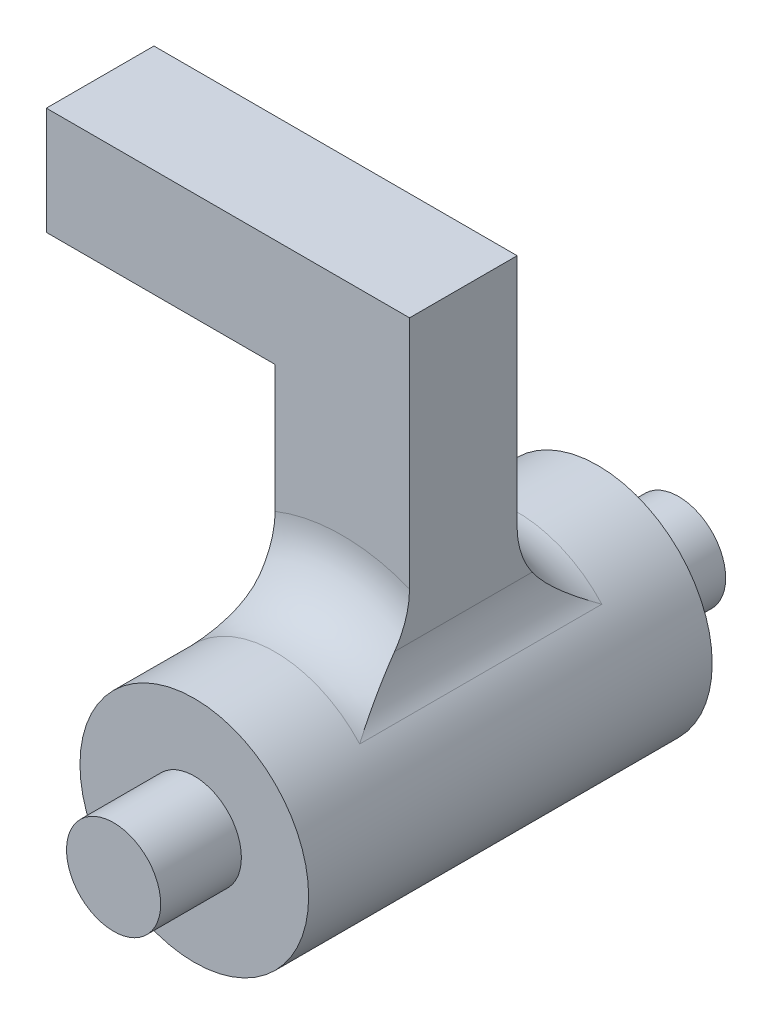
ISO-10303-21;
HEADER;
FILE_DESCRIPTION(('STEP AP214'),'2;1');
FILE_NAME('part.step','',(''),(''),'','','');
FILE_SCHEMA(('AUTOMOTIVE_DESIGN { 1 0 10303 214 1 1 1 1 }'));
ENDSEC;
DATA;
#1=APPLICATION_CONTEXT('core data for automotive mechanical design processes');
#2=APPLICATION_PROTOCOL_DEFINITION('international standard','automotive_design',2000,#1);
#3=PRODUCT_CONTEXT('',#1,'mechanical');
#4=PRODUCT('Part','Part','',(#3));
#5=PRODUCT_RELATED_PRODUCT_CATEGORY('part','',(#4));
#6=PRODUCT_DEFINITION_FORMATION('','',#4);
#7=PRODUCT_DEFINITION_CONTEXT('part definition',#1,'design');
#8=PRODUCT_DEFINITION('design','',#6,#7);
#9=PRODUCT_DEFINITION_SHAPE('','',#8);
#10=(LENGTH_UNIT() NAMED_UNIT(*) SI_UNIT(.MILLI.,.METRE.));
#11=(NAMED_UNIT(*) PLANE_ANGLE_UNIT() SI_UNIT($,.RADIAN.));
#12=(NAMED_UNIT(*) SI_UNIT($,.STERADIAN.) SOLID_ANGLE_UNIT());
#13=UNCERTAINTY_MEASURE_WITH_UNIT(LENGTH_MEASURE(1.E-05),#10,'distance_accuracy_value','');
#14=(GEOMETRIC_REPRESENTATION_CONTEXT(3) GLOBAL_UNCERTAINTY_ASSIGNED_CONTEXT((#13)) GLOBAL_UNIT_ASSIGNED_CONTEXT((#10,
#11,#12)) REPRESENTATION_CONTEXT('',''));
#15=CARTESIAN_POINT('',(0.,0.,0.));
#16=DIRECTION('',(0.,0.,1.));
#17=DIRECTION('',(1.,0.,0.));
#18=AXIS2_PLACEMENT_3D('',#15,#16,#17);
#19=CARTESIAN_POINT('',(-5.,6.87386354243376,-4.));
#20=DIRECTION('',(-1.,0.,0.));
#21=DIRECTION('',(0.,0.,1.));
#22=AXIS2_PLACEMENT_3D('',#19,#20,#21);
#23=PLANE('',#22);
#24=DIRECTION('',(0.,-1.,0.));
#25=VECTOR('',#24,1.);
#26=CARTESIAN_POINT('',(-5.,6.87386354243376,4.));
#27=LINE('',#26,#25);
#28=CARTESIAN_POINT('',(-5.,22.,4.));
#29=VERTEX_POINT('',#28);
#30=CARTESIAN_POINT('',(-5.,12.5399362039845,4.));
#31=VERTEX_POINT('',#30);
#32=EDGE_CURVE('E152',#29,#31,#27,.T.);
#33=ORIENTED_EDGE('',*,*,#32,.F.);
#34=DIRECTION('',(0.,0.,1.));
#35=VECTOR('',#34,1.);
#36=CARTESIAN_POINT('',(-5.,22.,-4.));
#37=LINE('',#36,#35);
#38=CARTESIAN_POINT('',(-5.,22.,-4.));
#39=VERTEX_POINT('',#38);
#40=EDGE_CURVE('E133',#39,#29,#37,.T.);
#41=ORIENTED_EDGE('',*,*,#40,.F.);
#42=DIRECTION('',(0.,-1.,0.));
#43=VECTOR('',#42,1.);
#44=CARTESIAN_POINT('',(-5.,6.87386354243376,-4.));
#45=LINE('',#44,#43);
#46=CARTESIAN_POINT('',(-5.,12.5399362039845,-4.));
#47=VERTEX_POINT('',#46);
#48=EDGE_CURVE('E139',#39,#47,#45,.T.);
#49=ORIENTED_EDGE('',*,*,#48,.T.);
#50=CARTESIAN_POINT('',(-5.,12.5399362039845,-4.));
#51=CARTESIAN_POINT('',(-5.,12.3694085919092,-3.99998714422389));
#52=CARTESIAN_POINT('',(-5.,12.1989063089274,-4.00752657628612));
#53=CARTESIAN_POINT('',(-5.,11.8592270326315,-4.03735103854057));
#54=CARTESIAN_POINT('',(-5.,11.6900497816317,-4.0596331257882));
#55=CARTESIAN_POINT('',(-5.,11.3583979344789,-4.11785187790329));
#56=CARTESIAN_POINT('',(-5.,11.1958612397524,-4.15343553921982));
#57=CARTESIAN_POINT('',(-5.,10.8743134865361,-4.23786698790894));
#58=CARTESIAN_POINT('',(-5.,10.7153021430001,-4.2867136986208));
#59=CARTESIAN_POINT('',(-5.,10.2970146643376,-4.4342238410057));
#60=CARTESIAN_POINT('',(-5.,10.0416978692588,-4.54437080778304));
#61=CARTESIAN_POINT('',(-5.,9.54316380755927,-4.80106627768752));
#62=CARTESIAN_POINT('',(-5.,9.30031970580392,-4.94833962290911));
#63=CARTESIAN_POINT('',(-5.,9.06917857360853,-5.11203717966495));
#64=B_SPLINE_CURVE_WITH_KNOTS('',3,(#50,#51,#52,#53,#54,#55,#56,#57,#58,#59,#60,#61,#62,#63),
.UNSPECIFIED.,.F.,.F.,(4,2,2,2,2,2,4),(0.,0.511379080440641,1.02265610962914,1.52123041197419,
2.01976425341574,2.85123665411686,3.70040530911326),.UNSPECIFIED.);
#65=CARTESIAN_POINT('',(-5.,9.06917857360853,-5.11203717966495));
#66=VERTEX_POINT('',#65);
#67=EDGE_CURVE('E192',#47,#66,#64,.T.);
#68=ORIENTED_EDGE('',*,*,#67,.T.);
#69=DIRECTION('',(0.,0.,-1.));
#70=VECTOR('',#69,1.);
#71=CARTESIAN_POINT('',(-5.,9.06917857360853,4.));
#72=LINE('',#71,#70);
#73=CARTESIAN_POINT('',(-5.,9.06917857360853,5.11203717966495));
#74=VERTEX_POINT('',#73);
#75=EDGE_CURVE('E179',#66,#74,#72,.F.);
#76=ORIENTED_EDGE('',*,*,#75,.T.);
#77=CARTESIAN_POINT('',(-5.,9.06917857360853,5.11203717966495));
#78=CARTESIAN_POINT('',(-5.,9.35083587334997,4.91258141395454));
#79=CARTESIAN_POINT('',(-5.,9.64971744535945,4.73756248373423));
#80=CARTESIAN_POINT('',(-5.,10.2648265740955,4.44415908956347));
#81=CARTESIAN_POINT('',(-5.,10.5804255183289,4.32445608668554));
#82=CARTESIAN_POINT('',(-5.,11.1666291518027,4.15632972078426));
#83=CARTESIAN_POINT('',(-5.,11.4346257489503,4.09876810840968));
#84=CARTESIAN_POINT('',(-5.,11.8433602430482,4.04005053354567));
#85=CARTESIAN_POINT('',(-5.,11.9822122250312,4.02507637574833));
#86=CARTESIAN_POINT('',(-5.,12.2606725330783,4.00504927505644));
#87=CARTESIAN_POINT('',(-5.,12.4002810845917,3.999999473362));
#88=CARTESIAN_POINT('',(-5.,12.5399362039845,4.));
#89=B_SPLINE_CURVE_WITH_KNOTS('',3,(#77,#78,#79,#80,#81,#82,#83,#84,#85,#86,#87,#88),
.UNSPECIFIED.,.F.,.F.,(4,2,2,2,2,4),(0.,1.03406706077952,2.042021674735,2.86168437258116,
3.2803387686077,3.69912565338787),.UNSPECIFIED.);
#90=EDGE_CURVE('E46',#74,#31,#89,.T.);
#91=ORIENTED_EDGE('',*,*,#90,.T.);
#92=EDGE_LOOP('',(#33,#41,#49,#68,#76,#91));
#93=FACE_BOUND('',#92,.T.);
#94=ADVANCED_FACE('F37',(#93),#23,.T.);
#95=CARTESIAN_POINT('',(0.,0.,-15.));
#96=DIRECTION('',(0.,0.,1.));
#97=DIRECTION('',(1.,0.,0.));
#98=AXIS2_PLACEMENT_3D('',#95,#96,#97);
#99=CYLINDRICAL_SURFACE('',#98,8.5);
#100=DIRECTION('',(0.,0.,1.));
#101=VECTOR('',#100,1.);
#102=CARTESIAN_POINT('',(-6.2962962962963,5.71022354634611,-15.));
#103=LINE('',#102,#101);
#104=CARTESIAN_POINT('',(-6.2962962962963,5.71022354634611,9.));
#105=VERTEX_POINT('',#104);
#106=CARTESIAN_POINT('',(-6.2962962962963,5.71022354634611,-9.));
#107=VERTEX_POINT('',#106);
#108=EDGE_CURVE('E172',#105,#107,#103,.F.);
#109=ORIENTED_EDGE('',*,*,#108,.T.);
#110=CARTESIAN_POINT('',(0.,0.,-9.));
#111=DIRECTION('',(0.,0.,1.));
#112=DIRECTION('',(1.,0.,0.));
#113=AXIS2_PLACEMENT_3D('',#110,#111,#112);
#114=CIRCLE('',#113,8.5);
#115=CARTESIAN_POINT('',(6.2962962962963,5.71022354634611,-9.));
#116=VERTEX_POINT('',#115);
#117=EDGE_CURVE('E174',#107,#116,#114,.F.);
#118=ORIENTED_EDGE('',*,*,#117,.T.);
#119=DIRECTION('',(0.,0.,1.));
#120=VECTOR('',#119,1.);
#121=CARTESIAN_POINT('',(6.2962962962963,5.71022354634611,-15.));
#122=LINE('',#121,#120);
#123=CARTESIAN_POINT('',(6.2962962962963,5.71022354634611,9.));
#124=VERTEX_POINT('',#123);
#125=EDGE_CURVE('E168',#116,#124,#122,.T.);
#126=ORIENTED_EDGE('',*,*,#125,.T.);
#127=CARTESIAN_POINT('',(0.,0.,9.));
#128=DIRECTION('',(0.,0.,1.));
#129=DIRECTION('',(1.,0.,0.));
#130=AXIS2_PLACEMENT_3D('',#127,#128,#129);
#131=CIRCLE('',#130,8.5);
#132=EDGE_CURVE('E170',#124,#105,#131,.T.);
#133=ORIENTED_EDGE('',*,*,#132,.T.);
#134=EDGE_LOOP('',(#109,#118,#126,#133));
#135=FACE_BOUND('',#134,.T.);
#136=CARTESIAN_POINT('',(0.,0.,-15.));
#137=DIRECTION('',(0.,0.,1.));
#138=DIRECTION('',(1.,0.,0.));
#139=AXIS2_PLACEMENT_3D('',#136,#137,#138);
#140=CIRCLE('',#139,8.5);
#141=CARTESIAN_POINT('',(8.5,0.,-15.));
#142=VERTEX_POINT('',#141);
#143=EDGE_CURVE('E165',#142,#142,#140,.T.);
#144=ORIENTED_EDGE('',*,*,#143,.T.);
#145=EDGE_LOOP('',(#144));
#146=FACE_BOUND('',#145,.T.);
#147=CARTESIAN_POINT('',(0.,0.,15.));
#148=DIRECTION('',(0.,0.,1.));
#149=DIRECTION('',(1.,0.,0.));
#150=AXIS2_PLACEMENT_3D('',#147,#148,#149);
#151=CIRCLE('',#150,8.5);
#152=CARTESIAN_POINT('',(8.5,0.,15.));
#153=VERTEX_POINT('',#152);
#154=EDGE_CURVE('E162',#153,#153,#151,.T.);
#155=ORIENTED_EDGE('',*,*,#154,.F.);
#156=EDGE_LOOP('',(#155));
#157=FACE_BOUND('',#156,.T.);
#158=ADVANCED_FACE('F232',(#135,#146,#157),#99,.T.);
#159=CARTESIAN_POINT('',(0.,0.,-15.));
#160=DIRECTION('',(0.,0.,1.));
#161=DIRECTION('',(1.,0.,0.));
#162=AXIS2_PLACEMENT_3D('',#159,#160,#161);
#163=PLANE('',#162);
#164=CARTESIAN_POINT('',(0.,0.,-15.));
#165=DIRECTION('',(0.,0.,1.));
#166=DIRECTION('',(1.,0.,0.));
#167=AXIS2_PLACEMENT_3D('',#164,#165,#166);
#168=CIRCLE('',#167,3.5);
#169=CARTESIAN_POINT('',(3.5,0.,-15.));
#170=VERTEX_POINT('',#169);
#171=EDGE_CURVE('E265',#170,#170,#168,.T.);
#172=ORIENTED_EDGE('',*,*,#171,.T.);
#173=EDGE_LOOP('',(#172));
#174=FACE_BOUND('',#173,.T.);
#175=ORIENTED_EDGE('',*,*,#143,.F.);
#176=EDGE_LOOP('',(#175));
#177=FACE_BOUND('',#176,.T.);
#178=ADVANCED_FACE('F380',(#174,#177),#163,.F.);
#179=CARTESIAN_POINT('',(0.,0.,15.));
#180=DIRECTION('',(0.,0.,1.));
#181=DIRECTION('',(1.,0.,0.));
#182=AXIS2_PLACEMENT_3D('',#179,#180,#181);
#183=PLANE('',#182);
#184=CARTESIAN_POINT('',(0.,0.,15.));
#185=DIRECTION('',(0.,0.,1.));
#186=DIRECTION('',(1.,0.,0.));
#187=AXIS2_PLACEMENT_3D('',#184,#185,#186);
#188=CIRCLE('',#187,3.5);
#189=CARTESIAN_POINT('',(3.5,0.,15.));
#190=VERTEX_POINT('',#189);
#191=EDGE_CURVE('E11',#190,#190,#188,.T.);
#192=ORIENTED_EDGE('',*,*,#191,.F.);
#193=EDGE_LOOP('',(#192));
#194=FACE_BOUND('',#193,.T.);
#195=ORIENTED_EDGE('',*,*,#154,.T.);
#196=EDGE_LOOP('',(#195));
#197=FACE_BOUND('',#196,.T.);
#198=ADVANCED_FACE('F209',(#194,#197),#183,.T.);
#199=CARTESIAN_POINT('',(5.,6.87386354243376,-4.));
#200=DIRECTION('',(1.,0.,0.));
#201=DIRECTION('',(0.,0.,-1.));
#202=AXIS2_PLACEMENT_3D('',#199,#200,#201);
#203=PLANE('',#202);
#204=CARTESIAN_POINT('',(5.,12.5399362039845,4.));
#205=CARTESIAN_POINT('',(5.,12.3694085919092,3.99998714422389));
#206=CARTESIAN_POINT('',(5.,12.1989063089274,4.00752657628612));
#207=CARTESIAN_POINT('',(5.,11.8592270326315,4.03735103854057));
#208=CARTESIAN_POINT('',(5.,11.6900497816317,4.0596331257882));
#209=CARTESIAN_POINT('',(5.,11.3583979344789,4.11785187790329));
#210=CARTESIAN_POINT('',(5.,11.1958612397524,4.15343553921982));
#211=CARTESIAN_POINT('',(5.,10.8743134865361,4.23786698790894));
#212=CARTESIAN_POINT('',(5.,10.7153021430001,4.2867136986208));
#213=CARTESIAN_POINT('',(5.,10.2970146643376,4.4342238410057));
#214=CARTESIAN_POINT('',(5.,10.0416978692588,4.54437080778304));
#215=CARTESIAN_POINT('',(5.,9.54316380755927,4.80106627768752));
#216=CARTESIAN_POINT('',(5.,9.30031970580392,4.94833962290911));
#217=CARTESIAN_POINT('',(5.,9.06917857360853,5.11203717966495));
#218=B_SPLINE_CURVE_WITH_KNOTS('',3,(#204,#205,#206,#207,#208,#209,#210,#211,#212,#213,#214,
#215,#216,#217),.UNSPECIFIED.,.F.,.F.,(4,2,2,2,2,2,4),(0.,0.511379080440641,1.02265610962914,
1.52123041197419,2.01976425341574,2.85123665411686,3.70040530911326),.UNSPECIFIED.);
#219=CARTESIAN_POINT('',(5.,12.5399362039845,4.));
#220=VERTEX_POINT('',#219);
#221=CARTESIAN_POINT('',(5.,9.06917857360853,5.11203717966495));
#222=VERTEX_POINT('',#221);
#223=EDGE_CURVE('E213',#220,#222,#218,.T.);
#224=ORIENTED_EDGE('',*,*,#223,.T.);
#225=DIRECTION('',(0.,0.,-1.));
#226=VECTOR('',#225,1.);
#227=CARTESIAN_POINT('',(5.,9.06917857360853,-4.));
#228=LINE('',#227,#226);
#229=CARTESIAN_POINT('',(5.,9.06917857360853,-5.11203717966495));
#230=VERTEX_POINT('',#229);
#231=EDGE_CURVE('E61',#222,#230,#228,.T.);
#232=ORIENTED_EDGE('',*,*,#231,.T.);
#233=CARTESIAN_POINT('',(5.,9.06917857360853,-5.11203717966495));
#234=CARTESIAN_POINT('',(5.,9.35083587334997,-4.91258141395454));
#235=CARTESIAN_POINT('',(5.,9.64971744535945,-4.73756248373423));
#236=CARTESIAN_POINT('',(5.,10.2648265740955,-4.44415908956347));
#237=CARTESIAN_POINT('',(5.,10.5804255183289,-4.32445608668554));
#238=CARTESIAN_POINT('',(5.,11.1666291518027,-4.15632972078426));
#239=CARTESIAN_POINT('',(5.,11.4346257489503,-4.09876810840968));
#240=CARTESIAN_POINT('',(5.,11.8433602430482,-4.04005053354567));
#241=CARTESIAN_POINT('',(5.,11.9822122250312,-4.02507637574833));
#242=CARTESIAN_POINT('',(5.,12.2606725330783,-4.00504927505644));
#243=CARTESIAN_POINT('',(5.,12.4002810845917,-3.999999473362));
#244=CARTESIAN_POINT('',(5.,12.5399362039845,-4.));
#245=B_SPLINE_CURVE_WITH_KNOTS('',3,(#233,#234,#235,#236,#237,#238,#239,#240,#241,#242,#243,
#244),.UNSPECIFIED.,.F.,.F.,(4,2,2,2,2,4),(0.,1.03406706077952,2.042021674735,2.86168437258116,
3.2803387686077,3.69912565338787),.UNSPECIFIED.);
#246=CARTESIAN_POINT('',(5.,12.5399362039845,-4.));
#247=VERTEX_POINT('',#246);
#248=EDGE_CURVE('E184',#230,#247,#245,.T.);
#249=ORIENTED_EDGE('',*,*,#248,.T.);
#250=DIRECTION('',(0.,1.,0.));
#251=VECTOR('',#250,1.);
#252=CARTESIAN_POINT('',(5.,6.87386354243376,-4.));
#253=LINE('',#252,#251);
#254=CARTESIAN_POINT('',(5.,30.,-4.));
#255=VERTEX_POINT('',#254);
#256=EDGE_CURVE('E154',#247,#255,#253,.T.);
#257=ORIENTED_EDGE('',*,*,#256,.T.);
#258=DIRECTION('',(0.,0.,1.));
#259=VECTOR('',#258,1.);
#260=CARTESIAN_POINT('',(5.,30.,-4.));
#261=LINE('',#260,#259);
#262=CARTESIAN_POINT('',(5.,30.,4.));
#263=VERTEX_POINT('',#262);
#264=EDGE_CURVE('E159',#255,#263,#261,.T.);
#265=ORIENTED_EDGE('',*,*,#264,.T.);
#266=DIRECTION('',(0.,1.,0.));
#267=VECTOR('',#266,1.);
#268=CARTESIAN_POINT('',(5.,6.87386354243376,4.));
#269=LINE('',#268,#267);
#270=EDGE_CURVE('E147',#220,#263,#269,.T.);
#271=ORIENTED_EDGE('',*,*,#270,.F.);
#272=EDGE_LOOP('',(#224,#232,#249,#257,#265,#271));
#273=FACE_BOUND('',#272,.T.);
#274=ADVANCED_FACE('F203',(#273),#203,.T.);
#275=CARTESIAN_POINT('',(-5.,30.,-4.));
#276=DIRECTION('',(0.,1.,0.));
#277=DIRECTION('',(0.,0.,1.));
#278=AXIS2_PLACEMENT_3D('',#275,#276,#277);
#279=PLANE('',#278);
#280=DIRECTION('',(-1.,0.,0.));
#281=VECTOR('',#280,1.);
#282=CARTESIAN_POINT('',(-5.,30.,-4.));
#283=LINE('',#282,#281);
#284=CARTESIAN_POINT('',(-22.,30.,-4.));
#285=VERTEX_POINT('',#284);
#286=EDGE_CURVE('E156',#255,#285,#283,.T.);
#287=ORIENTED_EDGE('',*,*,#286,.T.);
#288=DIRECTION('',(0.,0.,-1.));
#289=VECTOR('',#288,1.);
#290=CARTESIAN_POINT('',(-22.,30.,-4.));
#291=LINE('',#290,#289);
#292=CARTESIAN_POINT('',(-22.,30.,4.));
#293=VERTEX_POINT('',#292);
#294=EDGE_CURVE('E130',#293,#285,#291,.T.);
#295=ORIENTED_EDGE('',*,*,#294,.F.);
#296=DIRECTION('',(-1.,0.,0.));
#297=VECTOR('',#296,1.);
#298=CARTESIAN_POINT('',(-5.,30.,4.));
#299=LINE('',#298,#297);
#300=EDGE_CURVE('E149',#263,#293,#299,.T.);
#301=ORIENTED_EDGE('',*,*,#300,.F.);
#302=ORIENTED_EDGE('',*,*,#264,.F.);
#303=EDGE_LOOP('',(#287,#295,#301,#302));
#304=FACE_BOUND('',#303,.T.);
#305=ADVANCED_FACE('F208',(#304),#279,.T.);
#306=CARTESIAN_POINT('',(0.,0.,-4.));
#307=DIRECTION('',(0.,0.,1.));
#308=DIRECTION('',(1.,0.,0.));
#309=AXIS2_PLACEMENT_3D('',#306,#307,#308);
#310=PLANE('',#309);
#311=ORIENTED_EDGE('',*,*,#256,.F.);
#312=CARTESIAN_POINT('',(0.,0.,-4.));
#313=DIRECTION('',(0.,0.,1.));
#314=DIRECTION('',(1.,0.,0.));
#315=AXIS2_PLACEMENT_3D('',#312,#313,#314);
#316=CIRCLE('',#315,13.5);
#317=EDGE_CURVE('E177',#247,#47,#316,.T.);
#318=ORIENTED_EDGE('',*,*,#317,.T.);
#319=ORIENTED_EDGE('',*,*,#48,.F.);
#320=DIRECTION('',(1.,0.,0.));
#321=VECTOR('',#320,1.);
#322=CARTESIAN_POINT('',(-22.,22.,-4.));
#323=LINE('',#322,#321);
#324=CARTESIAN_POINT('',(-22.,22.,-4.));
#325=VERTEX_POINT('',#324);
#326=EDGE_CURVE('E119',#325,#39,#323,.T.);
#327=ORIENTED_EDGE('',*,*,#326,.F.);
#328=DIRECTION('',(0.,-1.,0.));
#329=VECTOR('',#328,1.);
#330=CARTESIAN_POINT('',(-22.,30.,-4.));
#331=LINE('',#330,#329);
#332=EDGE_CURVE('E124',#285,#325,#331,.T.);
#333=ORIENTED_EDGE('',*,*,#332,.F.);
#334=ORIENTED_EDGE('',*,*,#286,.F.);
#335=EDGE_LOOP('',(#311,#318,#319,#327,#333,#334));
#336=FACE_BOUND('',#335,.T.);
#337=ADVANCED_FACE('F137',(#336),#310,.F.);
#338=CARTESIAN_POINT('',(0.,0.,4.));
#339=DIRECTION('',(0.,0.,1.));
#340=DIRECTION('',(1.,0.,0.));
#341=AXIS2_PLACEMENT_3D('',#338,#339,#340);
#342=PLANE('',#341);
#343=ORIENTED_EDGE('',*,*,#300,.T.);
#344=DIRECTION('',(0.,1.,0.));
#345=VECTOR('',#344,1.);
#346=CARTESIAN_POINT('',(-22.,30.,4.));
#347=LINE('',#346,#345);
#348=CARTESIAN_POINT('',(-22.,22.,4.));
#349=VERTEX_POINT('',#348);
#350=EDGE_CURVE('E123',#349,#293,#347,.T.);
#351=ORIENTED_EDGE('',*,*,#350,.F.);
#352=DIRECTION('',(1.,0.,0.));
#353=VECTOR('',#352,1.);
#354=CARTESIAN_POINT('',(-22.,22.,4.));
#355=LINE('',#354,#353);
#356=EDGE_CURVE('E53',#349,#29,#355,.T.);
#357=ORIENTED_EDGE('',*,*,#356,.T.);
#358=ORIENTED_EDGE('',*,*,#32,.T.);
#359=CARTESIAN_POINT('',(0.,0.,4.));
#360=DIRECTION('',(0.,0.,1.));
#361=DIRECTION('',(1.,0.,0.));
#362=AXIS2_PLACEMENT_3D('',#359,#360,#361);
#363=CIRCLE('',#362,13.5);
#364=EDGE_CURVE('E181',#31,#220,#363,.F.);
#365=ORIENTED_EDGE('',*,*,#364,.T.);
#366=ORIENTED_EDGE('',*,*,#270,.T.);
#367=EDGE_LOOP('',(#343,#351,#357,#358,#365,#366));
#368=FACE_BOUND('',#367,.T.);
#369=ADVANCED_FACE('F237',(#368),#342,.T.);
#370=CARTESIAN_POINT('',(0.,0.,9.));
#371=DIRECTION('',(0.,0.,1.));
#372=DIRECTION('',(1.,0.,0.));
#373=AXIS2_PLACEMENT_3D('',#370,#371,#372);
#374=TOROIDAL_SURFACE('',#373,13.5,5.);
#375=ORIENTED_EDGE('',*,*,#364,.F.);
#376=ORIENTED_EDGE('',*,*,#90,.F.);
#377=CARTESIAN_POINT('',(-5.,9.06917857360853,5.11203717966495));
#378=CARTESIAN_POINT('',(-5.00000456566752,8.98149623455941,5.17412707086535));
#379=CARTESIAN_POINT('',(-5.00230580407492,8.8950971832883,5.23795960498045));
#380=CARTESIAN_POINT('',(-5.01113532528489,8.72495318604548,5.36870836115563));
#381=CARTESIAN_POINT('',(-5.0176614222909,8.64120689111644,5.43562297203663));
#382=CARTESIAN_POINT('',(-5.04298695211363,8.39438304664872,5.64012389415181));
#383=CARTESIAN_POINT('',(-5.06753758449846,8.2352536504483,5.78180156997005));
#384=CARTESIAN_POINT('',(-5.12926367484856,7.92894640891691,6.0721159477134));
#385=CARTESIAN_POINT('',(-5.16632563328503,7.78167536285091,6.22068007663244));
#386=CARTESIAN_POINT('',(-5.25130561853298,7.49692494635604,6.52404688750906));
#387=CARTESIAN_POINT('',(-5.29922905463911,7.3594504998795,6.67885264626912));
#388=CARTESIAN_POINT('',(-5.40927870973451,7.08183521069683,7.0071096101508));
#389=CARTESIAN_POINT('',(-5.47229235078683,6.94255752223811,7.18098930523587));
#390=CARTESIAN_POINT('',(-5.608450439954,6.67398020689119,7.53267376835567));
#391=CARTESIAN_POINT('',(-5.68160396824985,6.54468968685417,7.71048193297954));
#392=CARTESIAN_POINT('',(-5.83845873024377,6.29360442579319,8.07114210683326));
#393=CARTESIAN_POINT('',(-5.92230033266602,6.17194932899998,8.25402981016555));
#394=CARTESIAN_POINT('',(-6.09932946666348,5.93767586596806,8.62092832740647));
#395=CARTESIAN_POINT('',(-6.19251208640549,5.82505280587074,8.80493850376675));
#396=CARTESIAN_POINT('',(-6.29236130153601,5.71456625572437,8.99261452477556));
#397=CARTESIAN_POINT('',(-6.29432785178177,5.71239403349407,8.99630727037904));
#398=CARTESIAN_POINT('',(-6.2962962962963,5.71022354634611,9.));
#399=B_SPLINE_CURVE_WITH_KNOTS('',3,(#377,#378,#379,#380,#381,#382,#383,#384,#385,#386,#387,
#388,#389,#390,#391,#392,#393,#394,#395,#396,#397,#398),.UNSPECIFIED.,.F.,.F.,(4,2,2,2,2,2,2,2,
2,2,4),(0.,0.322207999236539,0.644249432211043,1.28661815615915,1.92330944507016,
2.56031852208615,3.25435709633224,3.94902124033134,4.65399014148018,5.35859027072397,
5.37273240845879),.UNSPECIFIED.);
#400=EDGE_CURVE('E150',#105,#74,#399,.F.);
#401=ORIENTED_EDGE('',*,*,#400,.F.);
#402=ORIENTED_EDGE('',*,*,#132,.F.);
#403=CARTESIAN_POINT('',(5.,9.06917857360853,5.11203717966495));
#404=CARTESIAN_POINT('',(5.00000456566752,8.98149623455941,5.17412707086535));
#405=CARTESIAN_POINT('',(5.00230580407492,8.8950971832883,5.23795960498045));
#406=CARTESIAN_POINT('',(5.01113532528489,8.72495318604548,5.36870836115563));
#407=CARTESIAN_POINT('',(5.0176614222909,8.64120689111644,5.43562297203663));
#408=CARTESIAN_POINT('',(5.04298695211363,8.39438304664872,5.64012389415181));
#409=CARTESIAN_POINT('',(5.06753758449846,8.2352536504483,5.78180156997005));
#410=CARTESIAN_POINT('',(5.12926367484856,7.92894640891691,6.0721159477134));
#411=CARTESIAN_POINT('',(5.16632563328503,7.78167536285091,6.22068007663244));
#412=CARTESIAN_POINT('',(5.25130561853298,7.49692494635604,6.52404688750906));
#413=CARTESIAN_POINT('',(5.29922905463911,7.3594504998795,6.67885264626912));
#414=CARTESIAN_POINT('',(5.40927870973451,7.08183521069683,7.0071096101508));
#415=CARTESIAN_POINT('',(5.47229235078683,6.94255752223811,7.18098930523587));
#416=CARTESIAN_POINT('',(5.608450439954,6.67398020689119,7.53267376835567));
#417=CARTESIAN_POINT('',(5.68160396824985,6.54468968685417,7.71048193297954));
#418=CARTESIAN_POINT('',(5.83845873024377,6.29360442579319,8.07114210683326));
#419=CARTESIAN_POINT('',(5.92230033266602,6.17194932899998,8.25402981016555));
#420=CARTESIAN_POINT('',(6.09932946666348,5.93767586596806,8.62092832740647));
#421=CARTESIAN_POINT('',(6.19251208640549,5.82505280587074,8.80493850376675));
#422=CARTESIAN_POINT('',(6.29236130153601,5.71456625572437,8.99261452477556));
#423=CARTESIAN_POINT('',(6.29432785178177,5.71239403349407,8.99630727037904));
#424=CARTESIAN_POINT('',(6.2962962962963,5.71022354634611,9.));
#425=B_SPLINE_CURVE_WITH_KNOTS('',3,(#403,#404,#405,#406,#407,#408,#409,#410,#411,#412,#413,
#414,#415,#416,#417,#418,#419,#420,#421,#422,#423,#424),.UNSPECIFIED.,.F.,.F.,(4,2,2,2,2,2,2,2,
2,2,4),(0.,0.322207999236539,0.644249432211043,1.28661815615915,1.92330944507016,
2.56031852208615,3.25435709633224,3.94902124033134,4.65399014148018,5.35859027072397,
5.37273240845879),.UNSPECIFIED.);
#426=EDGE_CURVE('E281',#222,#124,#425,.T.);
#427=ORIENTED_EDGE('',*,*,#426,.F.);
#428=ORIENTED_EDGE('',*,*,#223,.F.);
#429=EDGE_LOOP('',(#375,#376,#401,#402,#427,#428));
#430=FACE_BOUND('',#429,.T.);
#431=ADVANCED_FACE('F39',(#430),#374,.F.);
#432=CARTESIAN_POINT('',(-10.,9.06917857360853,-15.));
#433=DIRECTION('',(0.,0.,1.));
#434=DIRECTION('',(1.,0.,0.));
#435=AXIS2_PLACEMENT_3D('',#432,#433,#434);
#436=CYLINDRICAL_SURFACE('',#435,5.);
#437=ORIENTED_EDGE('',*,*,#75,.F.);
#438=CARTESIAN_POINT('',(-5.,9.06917857360853,-5.11203717966495));
#439=CARTESIAN_POINT('',(-5.00000456566752,8.98149623455942,-5.17412707086535));
#440=CARTESIAN_POINT('',(-5.00230580407492,8.89509718328832,-5.23795960498043));
#441=CARTESIAN_POINT('',(-5.01113532528489,8.72495318604552,-5.3687083611556));
#442=CARTESIAN_POINT('',(-5.01766142229089,8.64120689111649,-5.43562297203659));
#443=CARTESIAN_POINT('',(-5.04298695211362,8.39438304664879,-5.64012389415174));
#444=CARTESIAN_POINT('',(-5.06753758449845,8.23525365044839,-5.78180156996997));
#445=CARTESIAN_POINT('',(-5.12926367484854,7.928946408917,-6.07211594771331));
#446=CARTESIAN_POINT('',(-5.16632563328501,7.78167536285098,-6.22068007663237));
#447=CARTESIAN_POINT('',(-5.25130561853296,7.49692494635608,-6.52404688750902));
#448=CARTESIAN_POINT('',(-5.2992290546391,7.35945049987952,-6.6788526462691));
#449=CARTESIAN_POINT('',(-5.40927870973452,7.08183521069681,-7.0071096101508));
#450=CARTESIAN_POINT('',(-5.47229235078686,6.94255752223808,-7.18098930523585));
#451=CARTESIAN_POINT('',(-5.60845043995398,6.67398020689121,-7.5326737683557));
#452=CARTESIAN_POINT('',(-5.68160396824977,6.54468968685426,-7.71048193297964));
#453=CARTESIAN_POINT('',(-5.83845873024386,6.29360442579309,-8.07114210683316));
#454=CARTESIAN_POINT('',(-5.92230033266635,6.17194932899962,-8.25402981016517));
#455=CARTESIAN_POINT('',(-6.09932946666316,5.9376758659684,-8.62092832740684));
#456=CARTESIAN_POINT('',(-6.1925120864043,5.82505280587205,-8.80493850376815));
#457=CARTESIAN_POINT('',(-6.29236130153596,5.71456625572442,-8.99261452477562));
#458=CARTESIAN_POINT('',(-6.29432785178174,5.7123940334941,-8.99630727037907));
#459=CARTESIAN_POINT('',(-6.2962962962963,5.71022354634611,-9.));
#460=B_SPLINE_CURVE_WITH_KNOTS('',3,(#438,#439,#440,#441,#442,#443,#444,#445,#446,#447,#448,
#449,#450,#451,#452,#453,#454,#455,#456,#457,#458,#459),.UNSPECIFIED.,.F.,.F.,(4,2,2,2,2,2,2,2,
2,2,4),(0.,0.322207999236501,0.644249432210966,1.286618156159,1.92330944507009,2.56031852208615,
3.25435709633226,3.94902124033135,4.65399014148019,5.35859027072397,5.37273240845879),.UNSPECIFIED.);
#461=EDGE_CURVE('E142',#107,#66,#460,.F.);
#462=ORIENTED_EDGE('',*,*,#461,.F.);
#463=ORIENTED_EDGE('',*,*,#108,.F.);
#464=ORIENTED_EDGE('',*,*,#400,.T.);
#465=EDGE_LOOP('',(#437,#462,#463,#464));
#466=FACE_BOUND('',#465,.T.);
#467=ADVANCED_FACE('F302',(#466),#436,.F.);
#468=CARTESIAN_POINT('',(10.,9.06917857360853,-15.));
#469=DIRECTION('',(0.,0.,1.));
#470=DIRECTION('',(1.,0.,0.));
#471=AXIS2_PLACEMENT_3D('',#468,#469,#470);
#472=CYLINDRICAL_SURFACE('',#471,5.);
#473=ORIENTED_EDGE('',*,*,#426,.T.);
#474=ORIENTED_EDGE('',*,*,#125,.F.);
#475=CARTESIAN_POINT('',(5.,9.06917857360853,-5.11203717966495));
#476=CARTESIAN_POINT('',(5.00000456566752,8.98149623455942,-5.17412707086535));
#477=CARTESIAN_POINT('',(5.00230580407492,8.89509718328832,-5.23795960498043));
#478=CARTESIAN_POINT('',(5.01113532528489,8.72495318604552,-5.3687083611556));
#479=CARTESIAN_POINT('',(5.01766142229089,8.64120689111649,-5.43562297203659));
#480=CARTESIAN_POINT('',(5.04298695211362,8.39438304664879,-5.64012389415174));
#481=CARTESIAN_POINT('',(5.06753758449845,8.23525365044839,-5.78180156996997));
#482=CARTESIAN_POINT('',(5.12926367484854,7.928946408917,-6.07211594771331));
#483=CARTESIAN_POINT('',(5.16632563328501,7.78167536285098,-6.22068007663237));
#484=CARTESIAN_POINT('',(5.25130561853296,7.49692494635608,-6.52404688750902));
#485=CARTESIAN_POINT('',(5.2992290546391,7.35945049987952,-6.6788526462691));
#486=CARTESIAN_POINT('',(5.40927870973452,7.08183521069681,-7.0071096101508));
#487=CARTESIAN_POINT('',(5.47229235078686,6.94255752223808,-7.18098930523585));
#488=CARTESIAN_POINT('',(5.60845043995398,6.67398020689121,-7.5326737683557));
#489=CARTESIAN_POINT('',(5.68160396824977,6.54468968685426,-7.71048193297964));
#490=CARTESIAN_POINT('',(5.83845873024386,6.29360442579309,-8.07114210683316));
#491=CARTESIAN_POINT('',(5.92230033266635,6.17194932899962,-8.25402981016517));
#492=CARTESIAN_POINT('',(6.09932946666316,5.9376758659684,-8.62092832740684));
#493=CARTESIAN_POINT('',(6.1925120864043,5.82505280587205,-8.80493850376815));
#494=CARTESIAN_POINT('',(6.29236130153596,5.71456625572442,-8.99261452477562));
#495=CARTESIAN_POINT('',(6.29432785178174,5.7123940334941,-8.99630727037907));
#496=CARTESIAN_POINT('',(6.2962962962963,5.71022354634611,-9.));
#497=B_SPLINE_CURVE_WITH_KNOTS('',3,(#475,#476,#477,#478,#479,#480,#481,#482,#483,#484,#485,
#486,#487,#488,#489,#490,#491,#492,#493,#494,#495,#496),.UNSPECIFIED.,.F.,.F.,(4,2,2,2,2,2,2,2,
2,2,4),(0.,0.322207999236501,0.644249432210966,1.286618156159,1.92330944507009,2.56031852208615,
3.25435709633226,3.94902124033135,4.65399014148019,5.35859027072397,5.37273240845879),.UNSPECIFIED.);
#498=EDGE_CURVE('E140',#230,#116,#497,.T.);
#499=ORIENTED_EDGE('',*,*,#498,.F.);
#500=ORIENTED_EDGE('',*,*,#231,.F.);
#501=EDGE_LOOP('',(#473,#474,#499,#500));
#502=FACE_BOUND('',#501,.T.);
#503=ADVANCED_FACE('F299',(#502),#472,.F.);
#504=CARTESIAN_POINT('',(0.,0.,-9.));
#505=DIRECTION('',(0.,0.,1.));
#506=DIRECTION('',(1.,0.,0.));
#507=AXIS2_PLACEMENT_3D('',#504,#505,#506);
#508=TOROIDAL_SURFACE('',#507,13.5,5.);
#509=ORIENTED_EDGE('',*,*,#67,.F.);
#510=ORIENTED_EDGE('',*,*,#317,.F.);
#511=ORIENTED_EDGE('',*,*,#248,.F.);
#512=ORIENTED_EDGE('',*,*,#498,.T.);
#513=ORIENTED_EDGE('',*,*,#117,.F.);
#514=ORIENTED_EDGE('',*,*,#461,.T.);
#515=EDGE_LOOP('',(#509,#510,#511,#512,#513,#514));
#516=FACE_BOUND('',#515,.T.);
#517=ADVANCED_FACE('F199',(#516),#508,.F.);
#518=CARTESIAN_POINT('',(-22.,22.,-4.));
#519=DIRECTION('',(0.,1.,0.));
#520=DIRECTION('',(0.,0.,1.));
#521=AXIS2_PLACEMENT_3D('',#518,#519,#520);
#522=PLANE('',#521);
#523=ORIENTED_EDGE('',*,*,#40,.T.);
#524=ORIENTED_EDGE('',*,*,#356,.F.);
#525=DIRECTION('',(0.,0.,1.));
#526=VECTOR('',#525,1.);
#527=CARTESIAN_POINT('',(-22.,22.,-4.));
#528=LINE('',#527,#526);
#529=EDGE_CURVE('E115',#325,#349,#528,.T.);
#530=ORIENTED_EDGE('',*,*,#529,.F.);
#531=ORIENTED_EDGE('',*,*,#326,.T.);
#532=EDGE_LOOP('',(#523,#524,#530,#531));
#533=FACE_BOUND('',#532,.T.);
#534=ADVANCED_FACE('F117',(#533),#522,.F.);
#535=CARTESIAN_POINT('',(-22.,0.,0.));
#536=DIRECTION('',(-1.,0.,0.));
#537=DIRECTION('',(0.,0.,1.));
#538=AXIS2_PLACEMENT_3D('',#535,#536,#537);
#539=PLANE('',#538);
#540=ORIENTED_EDGE('',*,*,#332,.T.);
#541=ORIENTED_EDGE('',*,*,#529,.T.);
#542=ORIENTED_EDGE('',*,*,#350,.T.);
#543=ORIENTED_EDGE('',*,*,#294,.T.);
#544=EDGE_LOOP('',(#540,#541,#542,#543));
#545=FACE_BOUND('',#544,.T.);
#546=ADVANCED_FACE('F128',(#545),#539,.T.);
#547=CARTESIAN_POINT('',(0.,0.,21.));
#548=DIRECTION('',(0.,0.,1.));
#549=DIRECTION('',(1.,0.,0.));
#550=AXIS2_PLACEMENT_3D('',#547,#548,#549);
#551=PLANE('',#550);
#552=CARTESIAN_POINT('',(0.,0.,21.));
#553=DIRECTION('',(0.,0.,1.));
#554=DIRECTION('',(1.,0.,0.));
#555=AXIS2_PLACEMENT_3D('',#552,#553,#554);
#556=CIRCLE('',#555,3.5);
#557=CARTESIAN_POINT('',(3.5,0.,21.));
#558=VERTEX_POINT('',#557);
#559=EDGE_CURVE('E260',#558,#558,#556,.T.);
#560=ORIENTED_EDGE('',*,*,#559,.T.);
#561=EDGE_LOOP('',(#560));
#562=FACE_BOUND('',#561,.T.);
#563=ADVANCED_FACE('F244',(#562),#551,.T.);
#564=CARTESIAN_POINT('',(0.,0.,-21.));
#565=DIRECTION('',(0.,0.,1.));
#566=DIRECTION('',(1.,0.,0.));
#567=AXIS2_PLACEMENT_3D('',#564,#565,#566);
#568=CYLINDRICAL_SURFACE('',#567,3.5);
#569=ORIENTED_EDGE('',*,*,#191,.T.);
#570=EDGE_LOOP('',(#569));
#571=FACE_BOUND('',#570,.T.);
#572=ORIENTED_EDGE('',*,*,#559,.F.);
#573=EDGE_LOOP('',(#572));
#574=FACE_BOUND('',#573,.T.);
#575=ADVANCED_FACE('F245',(#571,#574),#568,.T.);
#576=CARTESIAN_POINT('',(0.,0.,-21.));
#577=DIRECTION('',(0.,0.,1.));
#578=DIRECTION('',(1.,0.,0.));
#579=AXIS2_PLACEMENT_3D('',#576,#577,#578);
#580=CIRCLE('',#579,3.5);
#581=CARTESIAN_POINT('',(3.5,0.,-21.));
#582=VERTEX_POINT('',#581);
#583=EDGE_CURVE('E262',#582,#582,#580,.T.);
#584=ORIENTED_EDGE('',*,*,#583,.T.);
#585=EDGE_LOOP('',(#584));
#586=FACE_BOUND('',#585,.T.);
#587=ORIENTED_EDGE('',*,*,#171,.F.);
#588=EDGE_LOOP('',(#587));
#589=FACE_BOUND('',#588,.T.);
#590=ADVANCED_FACE('F248',(#586,#589),#568,.T.);
#591=CARTESIAN_POINT('',(0.,0.,-21.));
#592=DIRECTION('',(0.,0.,1.));
#593=DIRECTION('',(1.,0.,0.));
#594=AXIS2_PLACEMENT_3D('',#591,#592,#593);
#595=PLANE('',#594);
#596=ORIENTED_EDGE('',*,*,#583,.F.);
#597=EDGE_LOOP('',(#596));
#598=FACE_BOUND('',#597,.T.);
#599=ADVANCED_FACE('F250',(#598),#595,.F.);
#600=CLOSED_SHELL('',(#94,#158,#178,#198,#274,#305,#337,#369,#431,#467,#503,#517,#534,#546,#563,
#575,#590,#599));
#601=MANIFOLD_SOLID_BREP('B2',#600);
#602=ADVANCED_BREP_SHAPE_REPRESENTATION('',(#18,#601),#14);
#603=SHAPE_DEFINITION_REPRESENTATION(#9,#602);
ENDSEC;
END-ISO-10303-21;
